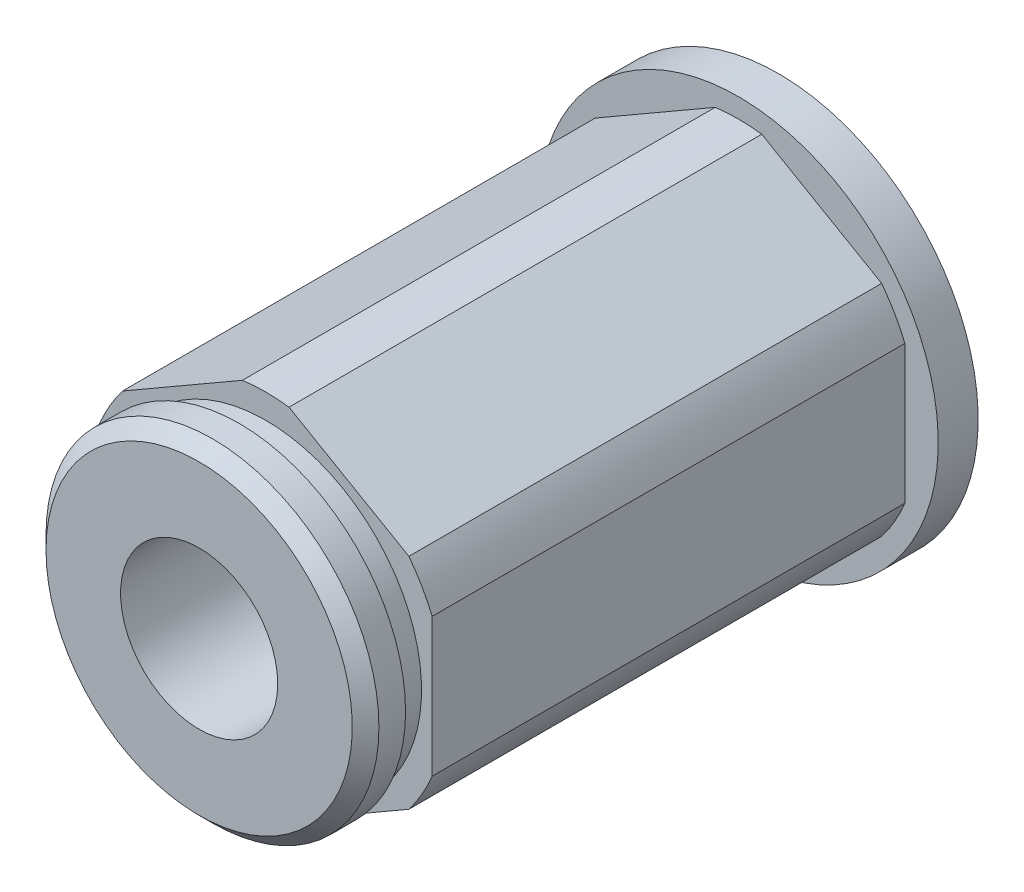
ISO-10303-21;
HEADER;
FILE_DESCRIPTION(('STEP AP214'),'2;1');
FILE_NAME('part.step','',(''),(''),'','','');
FILE_SCHEMA(('AUTOMOTIVE_DESIGN { 1 0 10303 214 1 1 1 1 }'));
ENDSEC;
DATA;
#1=APPLICATION_CONTEXT('core data for automotive mechanical design processes');
#2=APPLICATION_PROTOCOL_DEFINITION('international standard','automotive_design',2000,#1);
#3=PRODUCT_CONTEXT('',#1,'mechanical');
#4=PRODUCT('Part','Part','',(#3));
#5=PRODUCT_RELATED_PRODUCT_CATEGORY('part','',(#4));
#6=PRODUCT_DEFINITION_FORMATION('','',#4);
#7=PRODUCT_DEFINITION_CONTEXT('part definition',#1,'design');
#8=PRODUCT_DEFINITION('design','',#6,#7);
#9=PRODUCT_DEFINITION_SHAPE('','',#8);
#10=(LENGTH_UNIT() NAMED_UNIT(*) SI_UNIT(.MILLI.,.METRE.));
#11=(NAMED_UNIT(*) PLANE_ANGLE_UNIT() SI_UNIT($,.RADIAN.));
#12=(NAMED_UNIT(*) SI_UNIT($,.STERADIAN.) SOLID_ANGLE_UNIT());
#13=UNCERTAINTY_MEASURE_WITH_UNIT(LENGTH_MEASURE(1.E-05),#10,'distance_accuracy_value','');
#14=(GEOMETRIC_REPRESENTATION_CONTEXT(3) GLOBAL_UNCERTAINTY_ASSIGNED_CONTEXT((#13)) GLOBAL_UNIT_ASSIGNED_CONTEXT((#10,
#11,#12)) REPRESENTATION_CONTEXT('',''));
#15=CARTESIAN_POINT('',(0.,0.,0.));
#16=DIRECTION('',(0.,0.,1.));
#17=DIRECTION('',(1.,0.,0.));
#18=AXIS2_PLACEMENT_3D('',#15,#16,#17);
#19=CARTESIAN_POINT('',(-0.88841137786549,6.81942387054648,9.779));
#20=DIRECTION('',(0.5,-0.866025403784439,0.));
#21=DIRECTION('',(0.866025403784439,0.5,0.));
#22=AXIS2_PLACEMENT_3D('',#19,#20,#21);
#23=PLANE('',#22);
#24=DIRECTION('',(0.866025403784439,0.5,0.));
#25=VECTOR('',#24,1.);
#26=CARTESIAN_POINT('',(-0.88841137786549,6.81942387054648,-8.255));
#27=LINE('',#26,#25);
#28=CARTESIAN_POINT('',(-5.46158862213451,4.17909875751589,-8.255));
#29=VERTEX_POINT('',#28);
#30=CARTESIAN_POINT('',(-0.88841137786549,6.81942387054648,-8.255));
#31=VERTEX_POINT('',#30);
#32=EDGE_CURVE('E163',#29,#31,#27,.T.);
#33=ORIENTED_EDGE('',*,*,#32,.F.);
#34=DIRECTION('',(0.,0.,-1.));
#35=VECTOR('',#34,1.);
#36=CARTESIAN_POINT('',(-5.46158862213451,4.17909875751589,9.779));
#37=LINE('',#36,#35);
#38=CARTESIAN_POINT('',(-5.46158862213451,4.17909875751589,9.779));
#39=VERTEX_POINT('',#38);
#40=EDGE_CURVE('E45',#39,#29,#37,.T.);
#41=ORIENTED_EDGE('',*,*,#40,.F.);
#42=DIRECTION('',(-0.866025403784439,-0.5,0.));
#43=VECTOR('',#42,1.);
#44=CARTESIAN_POINT('',(-0.88841137786549,6.81942387054648,9.779));
#45=LINE('',#44,#43);
#46=CARTESIAN_POINT('',(-0.88841137786549,6.81942387054648,9.779));
#47=VERTEX_POINT('',#46);
#48=EDGE_CURVE('E204',#47,#39,#45,.T.);
#49=ORIENTED_EDGE('',*,*,#48,.F.);
#50=DIRECTION('',(0.,0.,-1.));
#51=VECTOR('',#50,1.);
#52=CARTESIAN_POINT('',(-0.88841137786549,6.81942387054648,9.779));
#53=LINE('',#52,#51);
#54=EDGE_CURVE('E11',#47,#31,#53,.T.);
#55=ORIENTED_EDGE('',*,*,#54,.T.);
#56=EDGE_LOOP('',(#33,#41,#49,#55));
#57=FACE_BOUND('',#56,.T.);
#58=ADVANCED_FACE('F37',(#57),#23,.F.);
#59=CARTESIAN_POINT('',(-6.35,2.64032511303059,9.779));
#60=DIRECTION('',(1.,0.,0.));
#61=DIRECTION('',(0.,0.,-1.));
#62=AXIS2_PLACEMENT_3D('',#59,#60,#61);
#63=PLANE('',#62);
#64=DIRECTION('',(0.,1.,0.));
#65=VECTOR('',#64,1.);
#66=CARTESIAN_POINT('',(-6.35,2.64032511303059,-8.255));
#67=LINE('',#66,#65);
#68=CARTESIAN_POINT('',(-6.35,-2.64032511303059,-8.255));
#69=VERTEX_POINT('',#68);
#70=CARTESIAN_POINT('',(-6.35,2.64032511303059,-8.255));
#71=VERTEX_POINT('',#70);
#72=EDGE_CURVE('E174',#69,#71,#67,.T.);
#73=ORIENTED_EDGE('',*,*,#72,.F.);
#74=DIRECTION('',(0.,0.,-1.));
#75=VECTOR('',#74,1.);
#76=CARTESIAN_POINT('',(-6.35,-2.64032511303059,9.779));
#77=LINE('',#76,#75);
#78=CARTESIAN_POINT('',(-6.35,-2.64032511303059,9.779));
#79=VERTEX_POINT('',#78);
#80=EDGE_CURVE('E242',#79,#69,#77,.T.);
#81=ORIENTED_EDGE('',*,*,#80,.F.);
#82=DIRECTION('',(0.,-1.,0.));
#83=VECTOR('',#82,1.);
#84=CARTESIAN_POINT('',(-6.35,2.64032511303059,9.779));
#85=LINE('',#84,#83);
#86=CARTESIAN_POINT('',(-6.35,2.64032511303059,9.779));
#87=VERTEX_POINT('',#86);
#88=EDGE_CURVE('E208',#87,#79,#85,.T.);
#89=ORIENTED_EDGE('',*,*,#88,.F.);
#90=DIRECTION('',(0.,0.,-1.));
#91=VECTOR('',#90,1.);
#92=CARTESIAN_POINT('',(-6.35,2.64032511303059,9.779));
#93=LINE('',#92,#91);
#94=EDGE_CURVE('E245',#87,#71,#93,.T.);
#95=ORIENTED_EDGE('',*,*,#94,.T.);
#96=EDGE_LOOP('',(#73,#81,#89,#95));
#97=FACE_BOUND('',#96,.T.);
#98=ADVANCED_FACE('F256',(#97),#63,.F.);
#99=CARTESIAN_POINT('',(-5.46158862213451,-4.17909875751589,9.779));
#100=DIRECTION('',(0.5,0.866025403784438,0.));
#101=DIRECTION('',(-0.866025403784439,0.5,0.));
#102=AXIS2_PLACEMENT_3D('',#99,#100,#101);
#103=PLANE('',#102);
#104=DIRECTION('',(-0.866025403784439,0.5,0.));
#105=VECTOR('',#104,1.);
#106=CARTESIAN_POINT('',(-5.46158862213451,-4.17909875751589,-8.255));
#107=LINE('',#106,#105);
#108=CARTESIAN_POINT('',(-0.888411377865495,-6.81942387054648,-8.255));
#109=VERTEX_POINT('',#108);
#110=CARTESIAN_POINT('',(-5.46158862213451,-4.17909875751589,-8.255));
#111=VERTEX_POINT('',#110);
#112=EDGE_CURVE('E172',#109,#111,#107,.T.);
#113=ORIENTED_EDGE('',*,*,#112,.F.);
#114=DIRECTION('',(0.,0.,-1.));
#115=VECTOR('',#114,1.);
#116=CARTESIAN_POINT('',(-0.888411377865495,-6.81942387054648,9.779));
#117=LINE('',#116,#115);
#118=CARTESIAN_POINT('',(-0.888411377865495,-6.81942387054648,9.779));
#119=VERTEX_POINT('',#118);
#120=EDGE_CURVE('E236',#119,#109,#117,.T.);
#121=ORIENTED_EDGE('',*,*,#120,.F.);
#122=DIRECTION('',(0.866025403784438,-0.5,0.));
#123=VECTOR('',#122,1.);
#124=CARTESIAN_POINT('',(-5.46158862213451,-4.17909875751589,9.779));
#125=LINE('',#124,#123);
#126=CARTESIAN_POINT('',(-5.46158862213451,-4.17909875751589,9.779));
#127=VERTEX_POINT('',#126);
#128=EDGE_CURVE('E212',#127,#119,#125,.T.);
#129=ORIENTED_EDGE('',*,*,#128,.F.);
#130=DIRECTION('',(0.,0.,-1.));
#131=VECTOR('',#130,1.);
#132=CARTESIAN_POINT('',(-5.46158862213451,-4.17909875751589,9.779));
#133=LINE('',#132,#131);
#134=EDGE_CURVE('E239',#127,#111,#133,.T.);
#135=ORIENTED_EDGE('',*,*,#134,.T.);
#136=EDGE_LOOP('',(#113,#121,#129,#135));
#137=FACE_BOUND('',#136,.T.);
#138=ADVANCED_FACE('F281',(#137),#103,.F.);
#139=CARTESIAN_POINT('',(0.88841137786549,-6.81942387054648,9.779));
#140=DIRECTION('',(-0.5,0.866025403784439,0.));
#141=DIRECTION('',(-0.866025403784439,-0.5,0.));
#142=AXIS2_PLACEMENT_3D('',#139,#140,#141);
#143=PLANE('',#142);
#144=DIRECTION('',(-0.866025403784439,-0.5,0.));
#145=VECTOR('',#144,1.);
#146=CARTESIAN_POINT('',(0.88841137786549,-6.81942387054648,-8.255));
#147=LINE('',#146,#145);
#148=CARTESIAN_POINT('',(5.46158862213451,-4.17909875751589,-8.255));
#149=VERTEX_POINT('',#148);
#150=CARTESIAN_POINT('',(0.888411377865487,-6.81942387054648,-8.255));
#151=VERTEX_POINT('',#150);
#152=EDGE_CURVE('E160',#149,#151,#147,.T.);
#153=ORIENTED_EDGE('',*,*,#152,.F.);
#154=DIRECTION('',(0.,0.,-1.));
#155=VECTOR('',#154,1.);
#156=CARTESIAN_POINT('',(5.46158862213451,-4.17909875751589,9.779));
#157=LINE('',#156,#155);
#158=CARTESIAN_POINT('',(5.46158862213451,-4.17909875751589,9.779));
#159=VERTEX_POINT('',#158);
#160=EDGE_CURVE('E230',#159,#149,#157,.T.);
#161=ORIENTED_EDGE('',*,*,#160,.F.);
#162=DIRECTION('',(0.866025403784439,0.5,0.));
#163=VECTOR('',#162,1.);
#164=CARTESIAN_POINT('',(0.88841137786549,-6.81942387054648,9.779));
#165=LINE('',#164,#163);
#166=CARTESIAN_POINT('',(0.888411377865487,-6.81942387054648,9.779));
#167=VERTEX_POINT('',#166);
#168=EDGE_CURVE('E216',#167,#159,#165,.T.);
#169=ORIENTED_EDGE('',*,*,#168,.F.);
#170=DIRECTION('',(0.,0.,-1.));
#171=VECTOR('',#170,1.);
#172=CARTESIAN_POINT('',(0.888411377865487,-6.81942387054648,9.779));
#173=LINE('',#172,#171);
#174=EDGE_CURVE('E233',#167,#151,#173,.T.);
#175=ORIENTED_EDGE('',*,*,#174,.T.);
#176=EDGE_LOOP('',(#153,#161,#169,#175));
#177=FACE_BOUND('',#176,.T.);
#178=ADVANCED_FACE('F275',(#177),#143,.F.);
#179=CARTESIAN_POINT('',(6.35,-2.64032511303059,9.779));
#180=DIRECTION('',(-1.,0.,0.));
#181=DIRECTION('',(0.,0.,1.));
#182=AXIS2_PLACEMENT_3D('',#179,#180,#181);
#183=PLANE('',#182);
#184=DIRECTION('',(0.,-1.,0.));
#185=VECTOR('',#184,1.);
#186=CARTESIAN_POINT('',(6.35,-2.64032511303059,-8.255));
#187=LINE('',#186,#185);
#188=CARTESIAN_POINT('',(6.35,2.64032511303059,-8.255));
#189=VERTEX_POINT('',#188);
#190=CARTESIAN_POINT('',(6.35,-2.64032511303059,-8.255));
#191=VERTEX_POINT('',#190);
#192=EDGE_CURVE('E141',#189,#191,#187,.T.);
#193=ORIENTED_EDGE('',*,*,#192,.F.);
#194=DIRECTION('',(0.,0.,-1.));
#195=VECTOR('',#194,1.);
#196=CARTESIAN_POINT('',(6.35,2.64032511303059,9.779));
#197=LINE('',#196,#195);
#198=CARTESIAN_POINT('',(6.35,2.64032511303059,9.779));
#199=VERTEX_POINT('',#198);
#200=EDGE_CURVE('E128',#199,#189,#197,.T.);
#201=ORIENTED_EDGE('',*,*,#200,.F.);
#202=DIRECTION('',(0.,1.,0.));
#203=VECTOR('',#202,1.);
#204=CARTESIAN_POINT('',(6.35,-2.64032511303059,9.779));
#205=LINE('',#204,#203);
#206=CARTESIAN_POINT('',(6.35,-2.64032511303059,9.779));
#207=VERTEX_POINT('',#206);
#208=EDGE_CURVE('E221',#207,#199,#205,.T.);
#209=ORIENTED_EDGE('',*,*,#208,.F.);
#210=DIRECTION('',(0.,0.,-1.));
#211=VECTOR('',#210,1.);
#212=CARTESIAN_POINT('',(6.35,-2.64032511303059,9.779));
#213=LINE('',#212,#211);
#214=EDGE_CURVE('E136',#207,#191,#213,.T.);
#215=ORIENTED_EDGE('',*,*,#214,.T.);
#216=EDGE_LOOP('',(#193,#201,#209,#215));
#217=FACE_BOUND('',#216,.T.);
#218=ADVANCED_FACE('F142',(#217),#183,.F.);
#219=CARTESIAN_POINT('',(5.46158862213451,4.17909875751589,9.779));
#220=DIRECTION('',(-0.499999999999999,-0.866025403784439,0.));
#221=DIRECTION('',(0.866025403784439,-0.499999999999999,0.));
#222=AXIS2_PLACEMENT_3D('',#219,#220,#221);
#223=PLANE('',#222);
#224=DIRECTION('',(0.866025403784439,-0.499999999999999,0.));
#225=VECTOR('',#224,1.);
#226=CARTESIAN_POINT('',(5.46158862213451,4.17909875751589,-8.255));
#227=LINE('',#226,#225);
#228=CARTESIAN_POINT('',(0.888411377865485,6.81942387054648,-8.255));
#229=VERTEX_POINT('',#228);
#230=CARTESIAN_POINT('',(5.46158862213451,4.17909875751589,-8.255));
#231=VERTEX_POINT('',#230);
#232=EDGE_CURVE('E52',#229,#231,#227,.T.);
#233=ORIENTED_EDGE('',*,*,#232,.F.);
#234=DIRECTION('',(0.,0.,-1.));
#235=VECTOR('',#234,1.);
#236=CARTESIAN_POINT('',(0.888411377865485,6.81942387054648,9.779));
#237=LINE('',#236,#235);
#238=CARTESIAN_POINT('',(0.888411377865485,6.81942387054648,9.779));
#239=VERTEX_POINT('',#238);
#240=EDGE_CURVE('E226',#239,#229,#237,.T.);
#241=ORIENTED_EDGE('',*,*,#240,.F.);
#242=DIRECTION('',(-0.866025403784439,0.499999999999999,0.));
#243=VECTOR('',#242,1.);
#244=CARTESIAN_POINT('',(5.46158862213451,4.17909875751589,9.779));
#245=LINE('',#244,#243);
#246=CARTESIAN_POINT('',(5.46158862213451,4.17909875751589,9.779));
#247=VERTEX_POINT('',#246);
#248=EDGE_CURVE('E224',#247,#239,#245,.T.);
#249=ORIENTED_EDGE('',*,*,#248,.F.);
#250=DIRECTION('',(0.,0.,-1.));
#251=VECTOR('',#250,1.);
#252=CARTESIAN_POINT('',(5.46158862213451,4.17909875751589,9.779));
#253=LINE('',#252,#251);
#254=EDGE_CURVE('E137',#247,#231,#253,.T.);
#255=ORIENTED_EDGE('',*,*,#254,.T.);
#256=EDGE_LOOP('',(#233,#241,#249,#255));
#257=FACE_BOUND('',#256,.T.);
#258=ADVANCED_FACE('F268',(#257),#223,.F.);
#259=CARTESIAN_POINT('',(0.,0.,9.779));
#260=DIRECTION('',(0.,0.,-1.));
#261=DIRECTION('',(-1.,0.,0.));
#262=AXIS2_PLACEMENT_3D('',#259,#260,#261);
#263=CYLINDRICAL_SURFACE('',#262,6.87705);
#264=CARTESIAN_POINT('',(0.,0.,-8.255));
#265=DIRECTION('',(0.,0.,-1.));
#266=DIRECTION('',(-1.,0.,0.));
#267=AXIS2_PLACEMENT_3D('',#264,#265,#266);
#268=CIRCLE('',#267,6.87705);
#269=EDGE_CURVE('E59',#31,#229,#268,.T.);
#270=ORIENTED_EDGE('',*,*,#269,.F.);
#271=ORIENTED_EDGE('',*,*,#54,.F.);
#272=CARTESIAN_POINT('',(0.,0.,9.779));
#273=DIRECTION('',(0.,0.,1.));
#274=DIRECTION('',(1.,0.,0.));
#275=AXIS2_PLACEMENT_3D('',#272,#273,#274);
#276=CIRCLE('',#275,6.87705);
#277=EDGE_CURVE('E201',#239,#47,#276,.T.);
#278=ORIENTED_EDGE('',*,*,#277,.F.);
#279=ORIENTED_EDGE('',*,*,#240,.T.);
#280=EDGE_LOOP('',(#270,#271,#278,#279));
#281=FACE_BOUND('',#280,.T.);
#282=ADVANCED_FACE('F266',(#281),#263,.T.);
#283=CARTESIAN_POINT('',(0.,0.,9.779));
#284=DIRECTION('',(0.,0.,-1.));
#285=DIRECTION('',(-1.,0.,0.));
#286=AXIS2_PLACEMENT_3D('',#283,#284,#285);
#287=CYLINDRICAL_SURFACE('',#286,6.87705);
#288=CARTESIAN_POINT('',(0.,0.,-8.255));
#289=DIRECTION('',(0.,0.,-1.));
#290=DIRECTION('',(-1.,0.,0.));
#291=AXIS2_PLACEMENT_3D('',#288,#289,#290);
#292=CIRCLE('',#291,6.87705);
#293=EDGE_CURVE('E169',#71,#29,#292,.T.);
#294=ORIENTED_EDGE('',*,*,#293,.F.);
#295=ORIENTED_EDGE('',*,*,#94,.F.);
#296=CARTESIAN_POINT('',(0.,0.,9.779));
#297=DIRECTION('',(0.,0.,1.));
#298=DIRECTION('',(1.,0.,0.));
#299=AXIS2_PLACEMENT_3D('',#296,#297,#298);
#300=CIRCLE('',#299,6.87705);
#301=EDGE_CURVE('E206',#39,#87,#300,.T.);
#302=ORIENTED_EDGE('',*,*,#301,.F.);
#303=ORIENTED_EDGE('',*,*,#40,.T.);
#304=EDGE_LOOP('',(#294,#295,#302,#303));
#305=FACE_BOUND('',#304,.T.);
#306=ADVANCED_FACE('F251',(#305),#287,.T.);
#307=CARTESIAN_POINT('',(0.,0.,9.779));
#308=DIRECTION('',(0.,0.,-1.));
#309=DIRECTION('',(-1.,0.,0.));
#310=AXIS2_PLACEMENT_3D('',#307,#308,#309);
#311=CYLINDRICAL_SURFACE('',#310,6.87705);
#312=CARTESIAN_POINT('',(0.,0.,-8.255));
#313=DIRECTION('',(0.,0.,-1.));
#314=DIRECTION('',(-1.,0.,0.));
#315=AXIS2_PLACEMENT_3D('',#312,#313,#314);
#316=CIRCLE('',#315,6.87705);
#317=EDGE_CURVE('E177',#111,#69,#316,.T.);
#318=ORIENTED_EDGE('',*,*,#317,.F.);
#319=ORIENTED_EDGE('',*,*,#134,.F.);
#320=CARTESIAN_POINT('',(0.,0.,9.779));
#321=DIRECTION('',(0.,0.,1.));
#322=DIRECTION('',(1.,0.,0.));
#323=AXIS2_PLACEMENT_3D('',#320,#321,#322);
#324=CIRCLE('',#323,6.87705);
#325=EDGE_CURVE('E210',#79,#127,#324,.T.);
#326=ORIENTED_EDGE('',*,*,#325,.F.);
#327=ORIENTED_EDGE('',*,*,#80,.T.);
#328=EDGE_LOOP('',(#318,#319,#326,#327));
#329=FACE_BOUND('',#328,.T.);
#330=ADVANCED_FACE('F260',(#329),#311,.T.);
#331=CARTESIAN_POINT('',(0.,0.,9.779));
#332=DIRECTION('',(0.,0.,-1.));
#333=DIRECTION('',(-1.,0.,0.));
#334=AXIS2_PLACEMENT_3D('',#331,#332,#333);
#335=CYLINDRICAL_SURFACE('',#334,6.87705);
#336=CARTESIAN_POINT('',(0.,0.,-8.255));
#337=DIRECTION('',(0.,0.,-1.));
#338=DIRECTION('',(-1.,0.,0.));
#339=AXIS2_PLACEMENT_3D('',#336,#337,#338);
#340=CIRCLE('',#339,6.87705);
#341=EDGE_CURVE('E166',#151,#109,#340,.T.);
#342=ORIENTED_EDGE('',*,*,#341,.F.);
#343=ORIENTED_EDGE('',*,*,#174,.F.);
#344=CARTESIAN_POINT('',(0.,0.,9.779));
#345=DIRECTION('',(0.,0.,1.));
#346=DIRECTION('',(1.,0.,0.));
#347=AXIS2_PLACEMENT_3D('',#344,#345,#346);
#348=CIRCLE('',#347,6.87705);
#349=EDGE_CURVE('E214',#119,#167,#348,.T.);
#350=ORIENTED_EDGE('',*,*,#349,.F.);
#351=ORIENTED_EDGE('',*,*,#120,.T.);
#352=EDGE_LOOP('',(#342,#343,#350,#351));
#353=FACE_BOUND('',#352,.T.);
#354=ADVANCED_FACE('F279',(#353),#335,.T.);
#355=CARTESIAN_POINT('',(0.,0.,9.779));
#356=DIRECTION('',(0.,0.,-1.));
#357=DIRECTION('',(-1.,0.,0.));
#358=AXIS2_PLACEMENT_3D('',#355,#356,#357);
#359=CYLINDRICAL_SURFACE('',#358,6.87705);
#360=CARTESIAN_POINT('',(0.,0.,-8.255));
#361=DIRECTION('',(0.,0.,-1.));
#362=DIRECTION('',(-1.,0.,0.));
#363=AXIS2_PLACEMENT_3D('',#360,#361,#362);
#364=CIRCLE('',#363,6.87705);
#365=EDGE_CURVE('E146',#191,#149,#364,.T.);
#366=ORIENTED_EDGE('',*,*,#365,.F.);
#367=ORIENTED_EDGE('',*,*,#214,.F.);
#368=CARTESIAN_POINT('',(0.,0.,9.779));
#369=DIRECTION('',(0.,0.,1.));
#370=DIRECTION('',(1.,0.,0.));
#371=AXIS2_PLACEMENT_3D('',#368,#369,#370);
#372=CIRCLE('',#371,6.87705);
#373=EDGE_CURVE('E218',#159,#207,#372,.T.);
#374=ORIENTED_EDGE('',*,*,#373,.F.);
#375=ORIENTED_EDGE('',*,*,#160,.T.);
#376=EDGE_LOOP('',(#366,#367,#374,#375));
#377=FACE_BOUND('',#376,.T.);
#378=ADVANCED_FACE('F273',(#377),#359,.T.);
#379=CARTESIAN_POINT('',(0.,0.,9.779));
#380=DIRECTION('',(0.,0.,-1.));
#381=DIRECTION('',(-1.,0.,0.));
#382=AXIS2_PLACEMENT_3D('',#379,#380,#381);
#383=CYLINDRICAL_SURFACE('',#382,6.87705);
#384=CARTESIAN_POINT('',(0.,0.,-8.255));
#385=DIRECTION('',(0.,0.,-1.));
#386=DIRECTION('',(-1.,0.,0.));
#387=AXIS2_PLACEMENT_3D('',#384,#385,#386);
#388=CIRCLE('',#387,6.87705);
#389=EDGE_CURVE('E133',#231,#189,#388,.T.);
#390=ORIENTED_EDGE('',*,*,#389,.F.);
#391=ORIENTED_EDGE('',*,*,#254,.F.);
#392=CARTESIAN_POINT('',(0.,0.,9.779));
#393=DIRECTION('',(0.,0.,1.));
#394=DIRECTION('',(1.,0.,0.));
#395=AXIS2_PLACEMENT_3D('',#392,#393,#394);
#396=CIRCLE('',#395,6.87705);
#397=EDGE_CURVE('E134',#199,#247,#396,.T.);
#398=ORIENTED_EDGE('',*,*,#397,.F.);
#399=ORIENTED_EDGE('',*,*,#200,.T.);
#400=EDGE_LOOP('',(#390,#391,#398,#399));
#401=FACE_BOUND('',#400,.T.);
#402=ADVANCED_FACE('F130',(#401),#383,.T.);
#403=CARTESIAN_POINT('',(0.,0.,9.779));
#404=DIRECTION('',(0.,0.,1.));
#405=DIRECTION('',(1.,0.,0.));
#406=AXIS2_PLACEMENT_3D('',#403,#404,#405);
#407=PLANE('',#406);
#408=CARTESIAN_POINT('',(0.,0.,9.779));
#409=DIRECTION('',(0.,0.,-1.));
#410=DIRECTION('',(-1.,0.,0.));
#411=AXIS2_PLACEMENT_3D('',#408,#409,#410);
#412=CIRCLE('',#411,5.9436);
#413=CARTESIAN_POINT('',(-5.9436,0.,9.779));
#414=VERTEX_POINT('',#413);
#415=EDGE_CURVE('E198',#414,#414,#412,.T.);
#416=ORIENTED_EDGE('',*,*,#415,.T.);
#417=EDGE_LOOP('',(#416));
#418=FACE_BOUND('',#417,.T.);
#419=ORIENTED_EDGE('',*,*,#373,.T.);
#420=ORIENTED_EDGE('',*,*,#208,.T.);
#421=ORIENTED_EDGE('',*,*,#397,.T.);
#422=ORIENTED_EDGE('',*,*,#248,.T.);
#423=ORIENTED_EDGE('',*,*,#277,.T.);
#424=ORIENTED_EDGE('',*,*,#48,.T.);
#425=ORIENTED_EDGE('',*,*,#301,.T.);
#426=ORIENTED_EDGE('',*,*,#88,.T.);
#427=ORIENTED_EDGE('',*,*,#325,.T.);
#428=ORIENTED_EDGE('',*,*,#128,.T.);
#429=ORIENTED_EDGE('',*,*,#349,.T.);
#430=ORIENTED_EDGE('',*,*,#168,.T.);
#431=EDGE_LOOP('',(#419,#420,#421,#422,#423,#424,#425,#426,#427,#428,#429,#430));
#432=FACE_BOUND('',#431,.T.);
#433=ADVANCED_FACE('F39',(#418,#432),#407,.T.);
#434=CARTESIAN_POINT('',(0.,0.,-9.779));
#435=DIRECTION('',(0.,0.,1.));
#436=DIRECTION('',(1.,0.,0.));
#437=AXIS2_PLACEMENT_3D('',#434,#435,#436);
#438=PLANE('',#437);
#439=CARTESIAN_POINT('',(0.,0.,-9.779));
#440=DIRECTION('',(0.,0.,1.));
#441=DIRECTION('',(1.,0.,0.));
#442=AXIS2_PLACEMENT_3D('',#439,#440,#441);
#443=CIRCLE('',#442,2.9972);
#444=CARTESIAN_POINT('',(2.9972,0.,-9.779));
#445=VERTEX_POINT('',#444);
#446=EDGE_CURVE('E183',#445,#445,#443,.T.);
#447=ORIENTED_EDGE('',*,*,#446,.T.);
#448=EDGE_LOOP('',(#447));
#449=FACE_BOUND('',#448,.T.);
#450=CARTESIAN_POINT('',(0.,0.,-9.779));
#451=DIRECTION('',(0.,0.,-1.));
#452=DIRECTION('',(-1.,0.,0.));
#453=AXIS2_PLACEMENT_3D('',#450,#451,#452);
#454=CIRCLE('',#453,7.62);
#455=CARTESIAN_POINT('',(-7.62,0.,-9.779));
#456=VERTEX_POINT('',#455);
#457=EDGE_CURVE('E154',#456,#456,#454,.T.);
#458=ORIENTED_EDGE('',*,*,#457,.T.);
#459=EDGE_LOOP('',(#458));
#460=FACE_BOUND('',#459,.T.);
#461=ADVANCED_FACE('F299',(#449,#460),#438,.F.);
#462=CARTESIAN_POINT('',(0.,0.,-38.2778));
#463=DIRECTION('',(0.,0.,-1.));
#464=DIRECTION('',(-1.,0.,0.));
#465=AXIS2_PLACEMENT_3D('',#462,#463,#464);
#466=CYLINDRICAL_SURFACE('',#465,5.9436);
#467=CARTESIAN_POINT('',(0.,0.,10.795));
#468=DIRECTION('',(0.,0.,-1.));
#469=DIRECTION('',(-1.,0.,0.));
#470=AXIS2_PLACEMENT_3D('',#467,#468,#469);
#471=CIRCLE('',#470,5.9436);
#472=CARTESIAN_POINT('',(-5.9436,0.,10.795));
#473=VERTEX_POINT('',#472);
#474=EDGE_CURVE('E195',#473,#473,#471,.T.);
#475=ORIENTED_EDGE('',*,*,#474,.T.);
#476=EDGE_LOOP('',(#475));
#477=FACE_BOUND('',#476,.T.);
#478=ORIENTED_EDGE('',*,*,#415,.F.);
#479=EDGE_LOOP('',(#478));
#480=FACE_BOUND('',#479,.T.);
#481=ADVANCED_FACE('F301',(#477,#480),#466,.T.);
#482=CARTESIAN_POINT('',(0.,5.9436,10.795));
#483=DIRECTION('',(0.,0.,-1.));
#484=DIRECTION('',(-1.,0.,0.));
#485=AXIS2_PLACEMENT_3D('',#482,#483,#484);
#486=PLANE('',#485);
#487=CARTESIAN_POINT('',(0.,0.,10.795));
#488=DIRECTION('',(0.,0.,-1.));
#489=DIRECTION('',(-1.,0.,0.));
#490=AXIS2_PLACEMENT_3D('',#487,#488,#489);
#491=CIRCLE('',#490,6.35);
#492=CARTESIAN_POINT('',(-6.35,0.,10.795));
#493=VERTEX_POINT('',#492);
#494=EDGE_CURVE('E192',#493,#493,#491,.T.);
#495=ORIENTED_EDGE('',*,*,#494,.T.);
#496=EDGE_LOOP('',(#495));
#497=FACE_BOUND('',#496,.T.);
#498=ORIENTED_EDGE('',*,*,#474,.F.);
#499=EDGE_LOOP('',(#498));
#500=FACE_BOUND('',#499,.T.);
#501=ADVANCED_FACE('F307',(#497,#500),#486,.T.);
#502=CARTESIAN_POINT('',(0.,0.,-38.2778));
#503=DIRECTION('',(0.,0.,-1.));
#504=DIRECTION('',(-1.,0.,0.));
#505=AXIS2_PLACEMENT_3D('',#502,#503,#504);
#506=CYLINDRICAL_SURFACE('',#505,6.35);
#507=CARTESIAN_POINT('',(0.,0.,11.811));
#508=DIRECTION('',(0.,0.,-1.));
#509=DIRECTION('',(-1.,0.,0.));
#510=AXIS2_PLACEMENT_3D('',#507,#508,#509);
#511=CIRCLE('',#510,6.35);
#512=CARTESIAN_POINT('',(-6.35,0.,11.811));
#513=VERTEX_POINT('',#512);
#514=EDGE_CURVE('E189',#513,#513,#511,.T.);
#515=ORIENTED_EDGE('',*,*,#514,.T.);
#516=EDGE_LOOP('',(#515));
#517=FACE_BOUND('',#516,.T.);
#518=ORIENTED_EDGE('',*,*,#494,.F.);
#519=EDGE_LOOP('',(#518));
#520=FACE_BOUND('',#519,.T.);
#521=ADVANCED_FACE('F337',(#517,#520),#506,.T.);
#522=CARTESIAN_POINT('',(0.,0.,11.811));
#523=DIRECTION('',(0.,0.,-1.));
#524=DIRECTION('',(-1.,0.,0.));
#525=AXIS2_PLACEMENT_3D('',#522,#523,#524);
#526=CONICAL_SURFACE('',#525,6.35,0.785398163397453);
#527=CARTESIAN_POINT('',(0.,0.,12.319));
#528=DIRECTION('',(0.,0.,-1.));
#529=DIRECTION('',(-1.,0.,0.));
#530=AXIS2_PLACEMENT_3D('',#527,#528,#529);
#531=CIRCLE('',#530,5.842);
#532=CARTESIAN_POINT('',(-5.842,0.,12.319));
#533=VERTEX_POINT('',#532);
#534=EDGE_CURVE('E186',#533,#533,#531,.T.);
#535=ORIENTED_EDGE('',*,*,#534,.T.);
#536=EDGE_LOOP('',(#535));
#537=FACE_BOUND('',#536,.T.);
#538=ORIENTED_EDGE('',*,*,#514,.F.);
#539=EDGE_LOOP('',(#538));
#540=FACE_BOUND('',#539,.T.);
#541=ADVANCED_FACE('F333',(#537,#540),#526,.T.);
#542=CARTESIAN_POINT('',(0.,5.842,12.319));
#543=DIRECTION('',(0.,0.,1.));
#544=DIRECTION('',(1.,0.,0.));
#545=AXIS2_PLACEMENT_3D('',#542,#543,#544);
#546=PLANE('',#545);
#547=CARTESIAN_POINT('',(0.,0.,12.319));
#548=DIRECTION('',(0.,0.,1.));
#549=DIRECTION('',(1.,0.,0.));
#550=AXIS2_PLACEMENT_3D('',#547,#548,#549);
#551=CIRCLE('',#550,2.9972);
#552=CARTESIAN_POINT('',(2.9972,0.,12.319));
#553=VERTEX_POINT('',#552);
#554=EDGE_CURVE('E180',#553,#553,#551,.T.);
#555=ORIENTED_EDGE('',*,*,#554,.F.);
#556=EDGE_LOOP('',(#555));
#557=FACE_BOUND('',#556,.T.);
#558=ORIENTED_EDGE('',*,*,#534,.F.);
#559=EDGE_LOOP('',(#558));
#560=FACE_BOUND('',#559,.T.);
#561=ADVANCED_FACE('F329',(#557,#560),#546,.T.);
#562=CARTESIAN_POINT('',(0.,0.,-9.779));
#563=DIRECTION('',(0.,0.,1.));
#564=DIRECTION('',(1.,0.,0.));
#565=AXIS2_PLACEMENT_3D('',#562,#563,#564);
#566=CYLINDRICAL_SURFACE('',#565,2.9972);
#567=ORIENTED_EDGE('',*,*,#446,.F.);
#568=EDGE_LOOP('',(#567));
#569=FACE_BOUND('',#568,.T.);
#570=ORIENTED_EDGE('',*,*,#554,.T.);
#571=EDGE_LOOP('',(#570));
#572=FACE_BOUND('',#571,.T.);
#573=ADVANCED_FACE('F323',(#569,#572),#566,.F.);
#574=CARTESIAN_POINT('',(0.,0.,-8.255));
#575=DIRECTION('',(0.,0.,-1.));
#576=DIRECTION('',(-1.,0.,0.));
#577=AXIS2_PLACEMENT_3D('',#574,#575,#576);
#578=PLANE('',#577);
#579=CARTESIAN_POINT('',(0.,0.,-8.255));
#580=DIRECTION('',(0.,0.,-1.));
#581=DIRECTION('',(-1.,0.,0.));
#582=AXIS2_PLACEMENT_3D('',#579,#580,#581);
#583=CIRCLE('',#582,7.62);
#584=CARTESIAN_POINT('',(-7.62,0.,-8.255));
#585=VERTEX_POINT('',#584);
#586=EDGE_CURVE('E150',#585,#585,#583,.T.);
#587=ORIENTED_EDGE('',*,*,#586,.F.);
#588=EDGE_LOOP('',(#587));
#589=FACE_BOUND('',#588,.T.);
#590=ORIENTED_EDGE('',*,*,#112,.T.);
#591=ORIENTED_EDGE('',*,*,#317,.T.);
#592=ORIENTED_EDGE('',*,*,#72,.T.);
#593=ORIENTED_EDGE('',*,*,#293,.T.);
#594=ORIENTED_EDGE('',*,*,#32,.T.);
#595=ORIENTED_EDGE('',*,*,#269,.T.);
#596=ORIENTED_EDGE('',*,*,#232,.T.);
#597=ORIENTED_EDGE('',*,*,#389,.T.);
#598=ORIENTED_EDGE('',*,*,#192,.T.);
#599=ORIENTED_EDGE('',*,*,#365,.T.);
#600=ORIENTED_EDGE('',*,*,#152,.T.);
#601=ORIENTED_EDGE('',*,*,#341,.T.);
#602=EDGE_LOOP('',(#590,#591,#592,#593,#594,#595,#596,#597,#598,#599,#600,#601));
#603=FACE_BOUND('',#602,.T.);
#604=ADVANCED_FACE('F149',(#589,#603),#578,.F.);
#605=CARTESIAN_POINT('',(0.,0.,-8.255));
#606=DIRECTION('',(0.,0.,-1.));
#607=DIRECTION('',(-1.,0.,0.));
#608=AXIS2_PLACEMENT_3D('',#605,#606,#607);
#609=CYLINDRICAL_SURFACE('',#608,7.62);
#610=CARTESIAN_POINT('',(-7.62,0.,-8.255));
#611=CARTESIAN_POINT('',(-7.62,0.,-8.270875));
#612=CARTESIAN_POINT('',(-7.62,0.,-8.28675));
#613=CARTESIAN_POINT('',(-7.62,0.,-8.3185));
#614=CARTESIAN_POINT('',(-7.62,0.,-8.334375));
#615=CARTESIAN_POINT('',(-7.62,0.,-8.366125));
#616=CARTESIAN_POINT('',(-7.62,0.,-8.382));
#617=CARTESIAN_POINT('',(-7.62,0.,-8.41375));
#618=CARTESIAN_POINT('',(-7.62,0.,-8.429625));
#619=CARTESIAN_POINT('',(-7.62,0.,-8.461375));
#620=CARTESIAN_POINT('',(-7.62,0.,-8.47725));
#621=CARTESIAN_POINT('',(-7.62,0.,-8.509));
#622=CARTESIAN_POINT('',(-7.62,0.,-8.524875));
#623=CARTESIAN_POINT('',(-7.62,0.,-8.556625));
#624=CARTESIAN_POINT('',(-7.62,0.,-8.5725));
#625=CARTESIAN_POINT('',(-7.62,0.,-8.60425));
#626=CARTESIAN_POINT('',(-7.62,0.,-8.620125));
#627=CARTESIAN_POINT('',(-7.62,0.,-8.651875));
#628=CARTESIAN_POINT('',(-7.62,0.,-8.66775));
#629=CARTESIAN_POINT('',(-7.62,0.,-8.6995));
#630=CARTESIAN_POINT('',(-7.62,0.,-8.715375));
#631=CARTESIAN_POINT('',(-7.62,0.,-8.747125));
#632=CARTESIAN_POINT('',(-7.62,0.,-8.763));
#633=CARTESIAN_POINT('',(-7.62,0.,-8.79475));
#634=CARTESIAN_POINT('',(-7.62,0.,-8.810625));
#635=CARTESIAN_POINT('',(-7.62,0.,-8.842375));
#636=CARTESIAN_POINT('',(-7.62,0.,-8.85825));
#637=CARTESIAN_POINT('',(-7.62,0.,-8.89));
#638=CARTESIAN_POINT('',(-7.62,0.,-8.905875));
#639=CARTESIAN_POINT('',(-7.62,0.,-8.937625));
#640=CARTESIAN_POINT('',(-7.62,0.,-8.9535));
#641=CARTESIAN_POINT('',(-7.62,0.,-8.98525));
#642=CARTESIAN_POINT('',(-7.62,0.,-9.001125));
#643=CARTESIAN_POINT('',(-7.62,0.,-9.032875));
#644=CARTESIAN_POINT('',(-7.62,0.,-9.04875));
#645=CARTESIAN_POINT('',(-7.62,0.,-9.0805));
#646=CARTESIAN_POINT('',(-7.62,0.,-9.096375));
#647=CARTESIAN_POINT('',(-7.62,0.,-9.128125));
#648=CARTESIAN_POINT('',(-7.62,0.,-9.144));
#649=CARTESIAN_POINT('',(-7.62,0.,-9.17575));
#650=CARTESIAN_POINT('',(-7.62,0.,-9.191625));
#651=CARTESIAN_POINT('',(-7.62,0.,-9.223375));
#652=CARTESIAN_POINT('',(-7.62,0.,-9.23925));
#653=CARTESIAN_POINT('',(-7.62,0.,-9.271));
#654=CARTESIAN_POINT('',(-7.62,0.,-9.286875));
#655=CARTESIAN_POINT('',(-7.62,0.,-9.318625));
#656=CARTESIAN_POINT('',(-7.62,0.,-9.3345));
#657=CARTESIAN_POINT('',(-7.62,0.,-9.36625));
#658=CARTESIAN_POINT('',(-7.62,0.,-9.382125));
#659=CARTESIAN_POINT('',(-7.62,0.,-9.413875));
#660=CARTESIAN_POINT('',(-7.62,0.,-9.42975));
#661=CARTESIAN_POINT('',(-7.62,0.,-9.4615));
#662=CARTESIAN_POINT('',(-7.62,0.,-9.477375));
#663=CARTESIAN_POINT('',(-7.62,0.,-9.509125));
#664=CARTESIAN_POINT('',(-7.62,0.,-9.525));
#665=CARTESIAN_POINT('',(-7.62,0.,-9.55675));
#666=CARTESIAN_POINT('',(-7.62,0.,-9.572625));
#667=CARTESIAN_POINT('',(-7.62,0.,-9.604375));
#668=CARTESIAN_POINT('',(-7.62,0.,-9.62025));
#669=CARTESIAN_POINT('',(-7.62,0.,-9.652));
#670=CARTESIAN_POINT('',(-7.62,0.,-9.667875));
#671=CARTESIAN_POINT('',(-7.62,0.,-9.699625));
#672=CARTESIAN_POINT('',(-7.62,0.,-9.7155));
#673=CARTESIAN_POINT('',(-7.62,0.,-9.74725));
#674=CARTESIAN_POINT('',(-7.62,0.,-9.763125));
#675=CARTESIAN_POINT('',(-7.62,0.,-9.779));
#676=B_SPLINE_CURVE_WITH_KNOTS('',3,(#610,#611,#612,#613,#614,#615,#616,#617,#618,#619,#620,
#621,#622,#623,#624,#625,#626,#627,#628,#629,#630,#631,#632,#633,#634,#635,#636,#637,#638,#639,
#640,#641,#642,#643,#644,#645,#646,#647,#648,#649,#650,#651,#652,#653,#654,#655,#656,#657,#658,
#659,#660,#661,#662,#663,#664,#665,#666,#667,#668,#669,#670,#671,#672,#673,#674,#675),
.UNSPECIFIED.,.F.,.F.,(4,2,2,2,2,2,2,2,2,2,2,2,2,2,2,2,2,2,2,2,2,2,2,2,2,2,2,2,2,2,2,2,4),(0.,
0.0476249999999991,0.0952499999999998,0.142874999999999,0.1905,0.238124999999999,0.28575,
0.333374999999999,0.380999999999999,0.428624999999998,0.476249999999999,0.523874999999998,
0.571499999999999,0.619124999999998,0.666749999999999,0.714374999999998,0.761999999999999,
0.809624999999998,0.857249999999999,0.904874999999999,0.952499999999998,1.000125,1.04775,
1.095375,1.143,1.190625,1.23825,1.285875,1.3335,1.381125,1.42875,1.476375,1.524),.UNSPECIFIED.);
#677=EDGE_CURVE('BSEAM316',#585,#456,#676,.T.);
#678=ORIENTED_EDGE('',*,*,#586,.T.);
#679=ORIENTED_EDGE('',*,*,#457,.F.);
#680=ORIENTED_EDGE('',*,*,#677,.T.);
#681=ORIENTED_EDGE('',*,*,#677,.F.);
#682=EDGE_LOOP('',(#678,#680,#679,#681));
#683=FACE_BOUND('',#682,.T.);
#684=ADVANCED_FACE('F316',(#683),#609,.T.);
#685=CLOSED_SHELL('',(#58,#98,#138,#178,#218,#258,#282,#306,#330,#354,#378,#402,#433,#461,#481,
#501,#521,#541,#561,#573,#604,#684));
#686=MANIFOLD_SOLID_BREP('B2',#685);
#687=ADVANCED_BREP_SHAPE_REPRESENTATION('',(#18,#686),#14);
#688=SHAPE_DEFINITION_REPRESENTATION(#9,#687);
ENDSEC;
END-ISO-10303-21;
